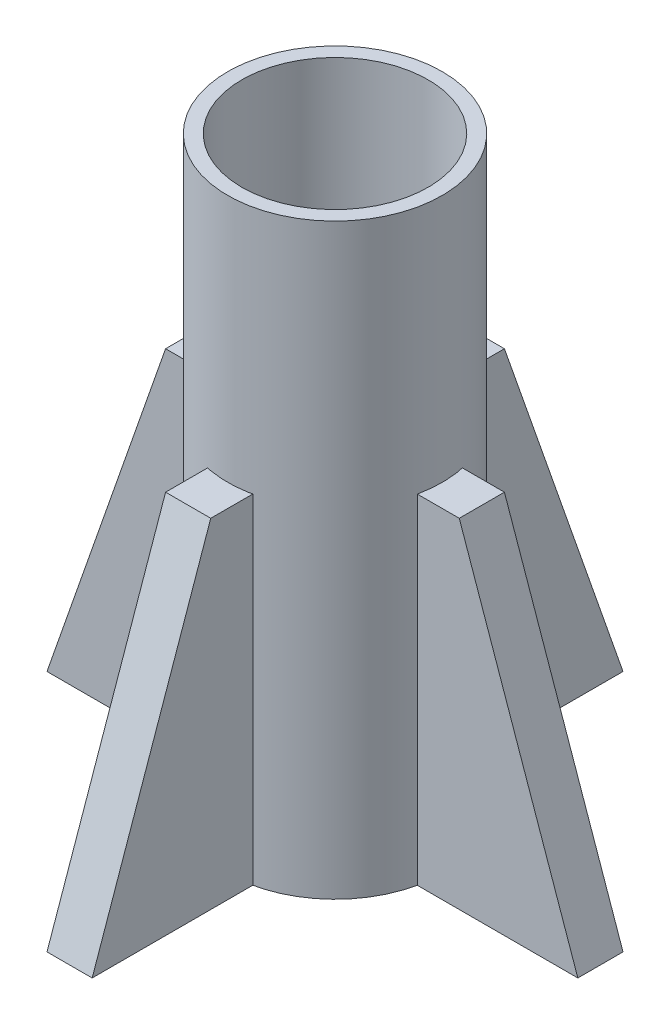
ISO-10303-21;
HEADER;
FILE_DESCRIPTION(('STEP AP214'),'2;1');
FILE_NAME('part.step','',(''),(''),'','','');
FILE_SCHEMA(('AUTOMOTIVE_DESIGN { 1 0 10303 214 1 1 1 1 }'));
ENDSEC;
DATA;
#1=APPLICATION_CONTEXT('core data for automotive mechanical design processes');
#2=APPLICATION_PROTOCOL_DEFINITION('international standard','automotive_design',2000,#1);
#3=PRODUCT_CONTEXT('',#1,'mechanical');
#4=PRODUCT('Part','Part','',(#3));
#5=PRODUCT_RELATED_PRODUCT_CATEGORY('part','',(#4));
#6=PRODUCT_DEFINITION_FORMATION('','',#4);
#7=PRODUCT_DEFINITION_CONTEXT('part definition',#1,'design');
#8=PRODUCT_DEFINITION('design','',#6,#7);
#9=PRODUCT_DEFINITION_SHAPE('','',#8);
#10=(LENGTH_UNIT() NAMED_UNIT(*) SI_UNIT(.MILLI.,.METRE.));
#11=(NAMED_UNIT(*) PLANE_ANGLE_UNIT() SI_UNIT($,.RADIAN.));
#12=(NAMED_UNIT(*) SI_UNIT($,.STERADIAN.) SOLID_ANGLE_UNIT());
#13=UNCERTAINTY_MEASURE_WITH_UNIT(LENGTH_MEASURE(1.E-05),#10,'distance_accuracy_value','');
#14=(GEOMETRIC_REPRESENTATION_CONTEXT(3) GLOBAL_UNCERTAINTY_ASSIGNED_CONTEXT((#13)) GLOBAL_UNIT_ASSIGNED_CONTEXT((#10,
#11,#12)) REPRESENTATION_CONTEXT('',''));
#15=CARTESIAN_POINT('',(0.,0.,0.));
#16=DIRECTION('',(0.,0.,1.));
#17=DIRECTION('',(1.,0.,0.));
#18=AXIS2_PLACEMENT_3D('',#15,#16,#17);
#19=CARTESIAN_POINT('',(8.5,30.,-2.));
#20=DIRECTION('',(0.,1.,0.));
#21=DIRECTION('',(0.,0.,1.));
#22=AXIS2_PLACEMENT_3D('',#19,#20,#21);
#23=PLANE('',#22);
#24=DIRECTION('',(0.,0.,1.));
#25=VECTOR('',#24,1.);
#26=CARTESIAN_POINT('',(8.5,30.,-2.));
#27=LINE('',#26,#25);
#28=CARTESIAN_POINT('',(8.5,30.,-2.));
#29=VERTEX_POINT('',#28);
#30=CARTESIAN_POINT('',(8.5,30.,2.));
#31=VERTEX_POINT('',#30);
#32=EDGE_CURVE('E51',#29,#31,#27,.T.);
#33=ORIENTED_EDGE('',*,*,#32,.T.);
#34=DIRECTION('',(-1.,0.,0.));
#35=VECTOR('',#34,1.);
#36=CARTESIAN_POINT('',(8.5,30.,2.));
#37=LINE('',#36,#35);
#38=CARTESIAN_POINT('',(13.,30.,2.));
#39=VERTEX_POINT('',#38);
#40=EDGE_CURVE('E88',#39,#31,#37,.T.);
#41=ORIENTED_EDGE('',*,*,#40,.F.);
#42=DIRECTION('',(0.,0.,1.));
#43=VECTOR('',#42,1.);
#44=CARTESIAN_POINT('',(13.,30.,-2.));
#45=LINE('',#44,#43);
#46=CARTESIAN_POINT('',(13.,30.,-2.));
#47=VERTEX_POINT('',#46);
#48=EDGE_CURVE('E12',#47,#39,#45,.T.);
#49=ORIENTED_EDGE('',*,*,#48,.F.);
#50=DIRECTION('',(-1.,0.,0.));
#51=VECTOR('',#50,1.);
#52=CARTESIAN_POINT('',(8.5,30.,-2.));
#53=LINE('',#52,#51);
#54=EDGE_CURVE('E89',#47,#29,#53,.T.);
#55=ORIENTED_EDGE('',*,*,#54,.T.);
#56=EDGE_LOOP('',(#33,#41,#49,#55));
#57=FACE_BOUND('',#56,.T.);
#58=ADVANCED_FACE('F48',(#57),#23,.T.);
#59=CARTESIAN_POINT('',(13.,30.,-2.));
#60=DIRECTION('',(0.943858356366017,0.330350424728106,0.));
#61=DIRECTION('',(-0.330350424728106,0.943858356366017,0.));
#62=AXIS2_PLACEMENT_3D('',#59,#60,#61);
#63=PLANE('',#62);
#64=ORIENTED_EDGE('',*,*,#48,.T.);
#65=DIRECTION('',(-0.330350424728106,0.943858356366017,0.));
#66=VECTOR('',#65,1.);
#67=CARTESIAN_POINT('',(13.,30.,2.));
#68=LINE('',#67,#66);
#69=CARTESIAN_POINT('',(23.5,0.,2.));
#70=VERTEX_POINT('',#69);
#71=EDGE_CURVE('E105',#70,#39,#68,.T.);
#72=ORIENTED_EDGE('',*,*,#71,.F.);
#73=DIRECTION('',(0.,0.,1.));
#74=VECTOR('',#73,1.);
#75=CARTESIAN_POINT('',(23.5,0.,-2.));
#76=LINE('',#75,#74);
#77=CARTESIAN_POINT('',(23.5,0.,-2.));
#78=VERTEX_POINT('',#77);
#79=EDGE_CURVE('E56',#78,#70,#76,.T.);
#80=ORIENTED_EDGE('',*,*,#79,.F.);
#81=DIRECTION('',(-0.330350424728106,0.943858356366017,0.));
#82=VECTOR('',#81,1.);
#83=CARTESIAN_POINT('',(13.,30.,-2.));
#84=LINE('',#83,#82);
#85=EDGE_CURVE('E94',#78,#47,#84,.T.);
#86=ORIENTED_EDGE('',*,*,#85,.T.);
#87=EDGE_LOOP('',(#64,#72,#80,#86));
#88=FACE_BOUND('',#87,.T.);
#89=ADVANCED_FACE('F120',(#88),#63,.T.);
#90=CARTESIAN_POINT('',(23.5,0.,-2.));
#91=DIRECTION('',(0.,-1.,0.));
#92=DIRECTION('',(0.,0.,-1.));
#93=AXIS2_PLACEMENT_3D('',#90,#91,#92);
#94=PLANE('',#93);
#95=ORIENTED_EDGE('',*,*,#79,.T.);
#96=DIRECTION('',(1.,0.,0.));
#97=VECTOR('',#96,1.);
#98=CARTESIAN_POINT('',(23.5,0.,2.));
#99=LINE('',#98,#97);
#100=CARTESIAN_POINT('',(8.5,0.,2.));
#101=VERTEX_POINT('',#100);
#102=EDGE_CURVE('E101',#101,#70,#99,.T.);
#103=ORIENTED_EDGE('',*,*,#102,.F.);
#104=DIRECTION('',(0.,0.,1.));
#105=VECTOR('',#104,1.);
#106=CARTESIAN_POINT('',(8.5,0.,-2.));
#107=LINE('',#106,#105);
#108=CARTESIAN_POINT('',(8.5,0.,-2.));
#109=VERTEX_POINT('',#108);
#110=EDGE_CURVE('E93',#109,#101,#107,.T.);
#111=ORIENTED_EDGE('',*,*,#110,.F.);
#112=DIRECTION('',(1.,0.,0.));
#113=VECTOR('',#112,1.);
#114=CARTESIAN_POINT('',(23.5,0.,-2.));
#115=LINE('',#114,#113);
#116=EDGE_CURVE('E113',#109,#78,#115,.T.);
#117=ORIENTED_EDGE('',*,*,#116,.T.);
#118=EDGE_LOOP('',(#95,#103,#111,#117));
#119=FACE_BOUND('',#118,.T.);
#120=ADVANCED_FACE('F117',(#119),#94,.T.);
#121=CARTESIAN_POINT('',(8.5,0.,-2.));
#122=DIRECTION('',(-1.,0.,0.));
#123=DIRECTION('',(0.,-1.,0.));
#124=AXIS2_PLACEMENT_3D('',#121,#122,#123);
#125=PLANE('',#124);
#126=ORIENTED_EDGE('',*,*,#110,.T.);
#127=DIRECTION('',(0.,-1.,0.));
#128=VECTOR('',#127,1.);
#129=CARTESIAN_POINT('',(8.5,0.,2.));
#130=LINE('',#129,#128);
#131=EDGE_CURVE('E96',#31,#101,#130,.T.);
#132=ORIENTED_EDGE('',*,*,#131,.F.);
#133=ORIENTED_EDGE('',*,*,#32,.F.);
#134=DIRECTION('',(0.,-1.,0.));
#135=VECTOR('',#134,1.);
#136=CARTESIAN_POINT('',(8.5,0.,-2.));
#137=LINE('',#136,#135);
#138=EDGE_CURVE('E111',#29,#109,#137,.T.);
#139=ORIENTED_EDGE('',*,*,#138,.T.);
#140=EDGE_LOOP('',(#126,#132,#133,#139));
#141=FACE_BOUND('',#140,.T.);
#142=ADVANCED_FACE('F97',(#141),#125,.T.);
#143=CARTESIAN_POINT('',(0.,0.,-2.));
#144=DIRECTION('',(0.,0.,1.));
#145=DIRECTION('',(1.,0.,0.));
#146=AXIS2_PLACEMENT_3D('',#143,#144,#145);
#147=PLANE('',#146);
#148=ORIENTED_EDGE('',*,*,#54,.F.);
#149=ORIENTED_EDGE('',*,*,#85,.F.);
#150=ORIENTED_EDGE('',*,*,#116,.F.);
#151=ORIENTED_EDGE('',*,*,#138,.F.);
#152=EDGE_LOOP('',(#148,#149,#150,#151));
#153=FACE_BOUND('',#152,.T.);
#154=ADVANCED_FACE('F122',(#153),#147,.F.);
#155=CARTESIAN_POINT('',(0.,0.,2.));
#156=DIRECTION('',(0.,0.,1.));
#157=DIRECTION('',(1.,0.,0.));
#158=AXIS2_PLACEMENT_3D('',#155,#156,#157);
#159=PLANE('',#158);
#160=ORIENTED_EDGE('',*,*,#40,.T.);
#161=ORIENTED_EDGE('',*,*,#131,.T.);
#162=ORIENTED_EDGE('',*,*,#102,.T.);
#163=ORIENTED_EDGE('',*,*,#71,.T.);
#164=EDGE_LOOP('',(#160,#161,#162,#163));
#165=FACE_BOUND('',#164,.T.);
#166=ADVANCED_FACE('F104',(#165),#159,.T.);
#167=CLOSED_SHELL('',(#58,#89,#120,#142,#154,#166));
#168=MANIFOLD_SOLID_BREP('B2',#167);
#169=CARTESIAN_POINT('',(-8.5,0.,-2.));
#170=DIRECTION('',(0.,-1.,0.));
#171=DIRECTION('',(1.,0.,0.));
#172=AXIS2_PLACEMENT_3D('',#169,#170,#171);
#173=PLANE('',#172);
#174=DIRECTION('',(0.,0.,1.));
#175=VECTOR('',#174,1.);
#176=CARTESIAN_POINT('',(-8.5,0.,-2.));
#177=LINE('',#176,#175);
#178=CARTESIAN_POINT('',(-8.5,0.,-2.));
#179=VERTEX_POINT('',#178);
#180=CARTESIAN_POINT('',(-8.5,0.,2.));
#181=VERTEX_POINT('',#180);
#182=EDGE_CURVE('E185',#179,#181,#177,.T.);
#183=ORIENTED_EDGE('',*,*,#182,.T.);
#184=DIRECTION('',(1.,0.,0.));
#185=VECTOR('',#184,1.);
#186=CARTESIAN_POINT('',(-8.5,0.,2.));
#187=LINE('',#186,#185);
#188=CARTESIAN_POINT('',(-23.5,0.,2.));
#189=VERTEX_POINT('',#188);
#190=EDGE_CURVE('E222',#189,#181,#187,.T.);
#191=ORIENTED_EDGE('',*,*,#190,.F.);
#192=DIRECTION('',(0.,0.,1.));
#193=VECTOR('',#192,1.);
#194=CARTESIAN_POINT('',(-23.5,0.,-2.));
#195=LINE('',#194,#193);
#196=CARTESIAN_POINT('',(-23.5,0.,-2.));
#197=VERTEX_POINT('',#196);
#198=EDGE_CURVE('E46',#197,#189,#195,.T.);
#199=ORIENTED_EDGE('',*,*,#198,.F.);
#200=DIRECTION('',(1.,0.,0.));
#201=VECTOR('',#200,1.);
#202=CARTESIAN_POINT('',(-8.5,0.,-2.));
#203=LINE('',#202,#201);
#204=EDGE_CURVE('E223',#197,#179,#203,.T.);
#205=ORIENTED_EDGE('',*,*,#204,.T.);
#206=EDGE_LOOP('',(#183,#191,#199,#205));
#207=FACE_BOUND('',#206,.T.);
#208=ADVANCED_FACE('F182',(#207),#173,.T.);
#209=CARTESIAN_POINT('',(-23.5,0.,-2.));
#210=DIRECTION('',(-0.943858356366017,0.330350424728106,0.));
#211=DIRECTION('',(-0.330350424728106,-0.943858356366018,0.));
#212=AXIS2_PLACEMENT_3D('',#209,#210,#211);
#213=PLANE('',#212);
#214=ORIENTED_EDGE('',*,*,#198,.T.);
#215=DIRECTION('',(-0.330350424728106,-0.943858356366017,0.));
#216=VECTOR('',#215,1.);
#217=CARTESIAN_POINT('',(-23.5,0.,2.));
#218=LINE('',#217,#216);
#219=CARTESIAN_POINT('',(-13.,30.,2.));
#220=VERTEX_POINT('',#219);
#221=EDGE_CURVE('E239',#220,#189,#218,.T.);
#222=ORIENTED_EDGE('',*,*,#221,.F.);
#223=DIRECTION('',(0.,0.,1.));
#224=VECTOR('',#223,1.);
#225=CARTESIAN_POINT('',(-13.,30.,-2.));
#226=LINE('',#225,#224);
#227=CARTESIAN_POINT('',(-13.,30.,-2.));
#228=VERTEX_POINT('',#227);
#229=EDGE_CURVE('E190',#228,#220,#226,.T.);
#230=ORIENTED_EDGE('',*,*,#229,.F.);
#231=DIRECTION('',(-0.330350424728106,-0.943858356366017,0.));
#232=VECTOR('',#231,1.);
#233=CARTESIAN_POINT('',(-23.5,0.,-2.));
#234=LINE('',#233,#232);
#235=EDGE_CURVE('E228',#228,#197,#234,.T.);
#236=ORIENTED_EDGE('',*,*,#235,.T.);
#237=EDGE_LOOP('',(#214,#222,#230,#236));
#238=FACE_BOUND('',#237,.T.);
#239=ADVANCED_FACE('F254',(#238),#213,.T.);
#240=CARTESIAN_POINT('',(-13.,30.,-2.));
#241=DIRECTION('',(0.,1.,0.));
#242=DIRECTION('',(0.,0.,1.));
#243=AXIS2_PLACEMENT_3D('',#240,#241,#242);
#244=PLANE('',#243);
#245=ORIENTED_EDGE('',*,*,#229,.T.);
#246=DIRECTION('',(-1.,0.,0.));
#247=VECTOR('',#246,1.);
#248=CARTESIAN_POINT('',(-13.,30.,2.));
#249=LINE('',#248,#247);
#250=CARTESIAN_POINT('',(-8.5,30.,2.));
#251=VERTEX_POINT('',#250);
#252=EDGE_CURVE('E235',#251,#220,#249,.T.);
#253=ORIENTED_EDGE('',*,*,#252,.F.);
#254=DIRECTION('',(0.,0.,1.));
#255=VECTOR('',#254,1.);
#256=CARTESIAN_POINT('',(-8.5,30.,-2.));
#257=LINE('',#256,#255);
#258=CARTESIAN_POINT('',(-8.5,30.,-2.));
#259=VERTEX_POINT('',#258);
#260=EDGE_CURVE('E227',#259,#251,#257,.T.);
#261=ORIENTED_EDGE('',*,*,#260,.F.);
#262=DIRECTION('',(-1.,0.,0.));
#263=VECTOR('',#262,1.);
#264=CARTESIAN_POINT('',(-13.,30.,-2.));
#265=LINE('',#264,#263);
#266=EDGE_CURVE('E247',#259,#228,#265,.T.);
#267=ORIENTED_EDGE('',*,*,#266,.T.);
#268=EDGE_LOOP('',(#245,#253,#261,#267));
#269=FACE_BOUND('',#268,.T.);
#270=ADVANCED_FACE('F251',(#269),#244,.T.);
#271=CARTESIAN_POINT('',(-8.5,30.,-2.));
#272=DIRECTION('',(1.,0.,0.));
#273=DIRECTION('',(0.,1.,0.));
#274=AXIS2_PLACEMENT_3D('',#271,#272,#273);
#275=PLANE('',#274);
#276=ORIENTED_EDGE('',*,*,#260,.T.);
#277=DIRECTION('',(0.,1.,0.));
#278=VECTOR('',#277,1.);
#279=CARTESIAN_POINT('',(-8.5,30.,2.));
#280=LINE('',#279,#278);
#281=EDGE_CURVE('E230',#181,#251,#280,.T.);
#282=ORIENTED_EDGE('',*,*,#281,.F.);
#283=ORIENTED_EDGE('',*,*,#182,.F.);
#284=DIRECTION('',(0.,1.,0.));
#285=VECTOR('',#284,1.);
#286=CARTESIAN_POINT('',(-8.5,30.,-2.));
#287=LINE('',#286,#285);
#288=EDGE_CURVE('E245',#179,#259,#287,.T.);
#289=ORIENTED_EDGE('',*,*,#288,.T.);
#290=EDGE_LOOP('',(#276,#282,#283,#289));
#291=FACE_BOUND('',#290,.T.);
#292=ADVANCED_FACE('F231',(#291),#275,.T.);
#293=CARTESIAN_POINT('',(0.,0.,-2.));
#294=DIRECTION('',(0.,0.,1.));
#295=DIRECTION('',(1.,0.,0.));
#296=AXIS2_PLACEMENT_3D('',#293,#294,#295);
#297=PLANE('',#296);
#298=ORIENTED_EDGE('',*,*,#204,.F.);
#299=ORIENTED_EDGE('',*,*,#235,.F.);
#300=ORIENTED_EDGE('',*,*,#266,.F.);
#301=ORIENTED_EDGE('',*,*,#288,.F.);
#302=EDGE_LOOP('',(#298,#299,#300,#301));
#303=FACE_BOUND('',#302,.T.);
#304=ADVANCED_FACE('F256',(#303),#297,.F.);
#305=CARTESIAN_POINT('',(0.,0.,2.));
#306=DIRECTION('',(0.,0.,1.));
#307=DIRECTION('',(1.,0.,0.));
#308=AXIS2_PLACEMENT_3D('',#305,#306,#307);
#309=PLANE('',#308);
#310=ORIENTED_EDGE('',*,*,#190,.T.);
#311=ORIENTED_EDGE('',*,*,#281,.T.);
#312=ORIENTED_EDGE('',*,*,#252,.T.);
#313=ORIENTED_EDGE('',*,*,#221,.T.);
#314=EDGE_LOOP('',(#310,#311,#312,#313));
#315=FACE_BOUND('',#314,.T.);
#316=ADVANCED_FACE('F238',(#315),#309,.T.);
#317=CLOSED_SHELL('',(#208,#239,#270,#292,#304,#316));
#318=MANIFOLD_SOLID_BREP('B6',#317);
#319=CARTESIAN_POINT('',(-2.,30.,-8.5));
#320=DIRECTION('',(0.,0.,1.));
#321=DIRECTION('',(0.,-1.,0.));
#322=AXIS2_PLACEMENT_3D('',#319,#320,#321);
#323=PLANE('',#322);
#324=DIRECTION('',(1.,0.,0.));
#325=VECTOR('',#324,1.);
#326=CARTESIAN_POINT('',(-2.,0.,-8.50000000000001));
#327=LINE('',#326,#325);
#328=CARTESIAN_POINT('',(-2.,0.,-8.50000000000001));
#329=VERTEX_POINT('',#328);
#330=CARTESIAN_POINT('',(2.,0.,-8.50000000000001));
#331=VERTEX_POINT('',#330);
#332=EDGE_CURVE('E319',#329,#331,#327,.T.);
#333=ORIENTED_EDGE('',*,*,#332,.T.);
#334=DIRECTION('',(0.,-1.,0.));
#335=VECTOR('',#334,1.);
#336=CARTESIAN_POINT('',(2.,30.,-8.5));
#337=LINE('',#336,#335);
#338=CARTESIAN_POINT('',(2.,30.,-8.5));
#339=VERTEX_POINT('',#338);
#340=EDGE_CURVE('E356',#339,#331,#337,.T.);
#341=ORIENTED_EDGE('',*,*,#340,.F.);
#342=DIRECTION('',(1.,0.,0.));
#343=VECTOR('',#342,1.);
#344=CARTESIAN_POINT('',(-2.,30.,-8.5));
#345=LINE('',#344,#343);
#346=CARTESIAN_POINT('',(-2.,30.,-8.5));
#347=VERTEX_POINT('',#346);
#348=EDGE_CURVE('E180',#347,#339,#345,.T.);
#349=ORIENTED_EDGE('',*,*,#348,.F.);
#350=DIRECTION('',(0.,-1.,0.));
#351=VECTOR('',#350,1.);
#352=CARTESIAN_POINT('',(-2.,30.,-8.5));
#353=LINE('',#352,#351);
#354=EDGE_CURVE('E357',#347,#329,#353,.T.);
#355=ORIENTED_EDGE('',*,*,#354,.T.);
#356=EDGE_LOOP('',(#333,#341,#349,#355));
#357=FACE_BOUND('',#356,.T.);
#358=ADVANCED_FACE('F316',(#357),#323,.T.);
#359=CARTESIAN_POINT('',(-2.,30.,-13.));
#360=DIRECTION('',(0.,1.,0.));
#361=DIRECTION('',(0.,0.,1.));
#362=AXIS2_PLACEMENT_3D('',#359,#360,#361);
#363=PLANE('',#362);
#364=ORIENTED_EDGE('',*,*,#348,.T.);
#365=DIRECTION('',(0.,0.,1.));
#366=VECTOR('',#365,1.);
#367=CARTESIAN_POINT('',(2.,30.,-13.));
#368=LINE('',#367,#366);
#369=CARTESIAN_POINT('',(2.,30.,-13.));
#370=VERTEX_POINT('',#369);
#371=EDGE_CURVE('E373',#370,#339,#368,.T.);
#372=ORIENTED_EDGE('',*,*,#371,.F.);
#373=DIRECTION('',(1.,0.,0.));
#374=VECTOR('',#373,1.);
#375=CARTESIAN_POINT('',(-2.,30.,-13.));
#376=LINE('',#375,#374);
#377=CARTESIAN_POINT('',(-2.,30.,-13.));
#378=VERTEX_POINT('',#377);
#379=EDGE_CURVE('E324',#378,#370,#376,.T.);
#380=ORIENTED_EDGE('',*,*,#379,.F.);
#381=DIRECTION('',(0.,0.,1.));
#382=VECTOR('',#381,1.);
#383=CARTESIAN_POINT('',(-2.,30.,-13.));
#384=LINE('',#383,#382);
#385=EDGE_CURVE('E362',#378,#347,#384,.T.);
#386=ORIENTED_EDGE('',*,*,#385,.T.);
#387=EDGE_LOOP('',(#364,#372,#380,#386));
#388=FACE_BOUND('',#387,.T.);
#389=ADVANCED_FACE('F390',(#388),#363,.T.);
#390=CARTESIAN_POINT('',(-2.,0.,-23.5));
#391=DIRECTION('',(0.,0.330350424728106,-0.943858356366017));
#392=DIRECTION('',(0.,0.943858356366018,0.330350424728106));
#393=AXIS2_PLACEMENT_3D('',#390,#391,#392);
#394=PLANE('',#393);
#395=ORIENTED_EDGE('',*,*,#379,.T.);
#396=DIRECTION('',(0.,0.943858356366017,0.330350424728106));
#397=VECTOR('',#396,1.);
#398=CARTESIAN_POINT('',(2.,0.,-23.5));
#399=LINE('',#398,#397);
#400=CARTESIAN_POINT('',(2.,0.,-23.5));
#401=VERTEX_POINT('',#400);
#402=EDGE_CURVE('E369',#401,#370,#399,.T.);
#403=ORIENTED_EDGE('',*,*,#402,.F.);
#404=DIRECTION('',(1.,0.,0.));
#405=VECTOR('',#404,1.);
#406=CARTESIAN_POINT('',(-2.,0.,-23.5));
#407=LINE('',#406,#405);
#408=CARTESIAN_POINT('',(-2.,0.,-23.5));
#409=VERTEX_POINT('',#408);
#410=EDGE_CURVE('E361',#409,#401,#407,.T.);
#411=ORIENTED_EDGE('',*,*,#410,.F.);
#412=DIRECTION('',(0.,0.943858356366017,0.330350424728106));
#413=VECTOR('',#412,1.);
#414=CARTESIAN_POINT('',(-2.,0.,-23.5));
#415=LINE('',#414,#413);
#416=EDGE_CURVE('E383',#409,#378,#415,.T.);
#417=ORIENTED_EDGE('',*,*,#416,.T.);
#418=EDGE_LOOP('',(#395,#403,#411,#417));
#419=FACE_BOUND('',#418,.T.);
#420=ADVANCED_FACE('F387',(#419),#394,.T.);
#421=CARTESIAN_POINT('',(-2.,0.,-8.50000000000001));
#422=DIRECTION('',(0.,-1.,0.));
#423=DIRECTION('',(0.,0.,-1.));
#424=AXIS2_PLACEMENT_3D('',#421,#422,#423);
#425=PLANE('',#424);
#426=ORIENTED_EDGE('',*,*,#410,.T.);
#427=DIRECTION('',(0.,0.,-1.));
#428=VECTOR('',#427,1.);
#429=CARTESIAN_POINT('',(2.,0.,-8.50000000000001));
#430=LINE('',#429,#428);
#431=EDGE_CURVE('E364',#331,#401,#430,.T.);
#432=ORIENTED_EDGE('',*,*,#431,.F.);
#433=ORIENTED_EDGE('',*,*,#332,.F.);
#434=DIRECTION('',(0.,0.,-1.));
#435=VECTOR('',#434,1.);
#436=CARTESIAN_POINT('',(-2.,0.,-8.50000000000001));
#437=LINE('',#436,#435);
#438=EDGE_CURVE('E381',#329,#409,#437,.T.);
#439=ORIENTED_EDGE('',*,*,#438,.T.);
#440=EDGE_LOOP('',(#426,#432,#433,#439));
#441=FACE_BOUND('',#440,.T.);
#442=ADVANCED_FACE('F365',(#441),#425,.T.);
#443=CARTESIAN_POINT('',(-2.,0.,0.));
#444=DIRECTION('',(1.,0.,0.));
#445=DIRECTION('',(0.,0.,-1.));
#446=AXIS2_PLACEMENT_3D('',#443,#444,#445);
#447=PLANE('',#446);
#448=ORIENTED_EDGE('',*,*,#354,.F.);
#449=ORIENTED_EDGE('',*,*,#385,.F.);
#450=ORIENTED_EDGE('',*,*,#416,.F.);
#451=ORIENTED_EDGE('',*,*,#438,.F.);
#452=EDGE_LOOP('',(#448,#449,#450,#451));
#453=FACE_BOUND('',#452,.T.);
#454=ADVANCED_FACE('F392',(#453),#447,.F.);
#455=CARTESIAN_POINT('',(2.,0.,0.));
#456=DIRECTION('',(1.,0.,0.));
#457=DIRECTION('',(0.,0.,-1.));
#458=AXIS2_PLACEMENT_3D('',#455,#456,#457);
#459=PLANE('',#458);
#460=ORIENTED_EDGE('',*,*,#340,.T.);
#461=ORIENTED_EDGE('',*,*,#431,.T.);
#462=ORIENTED_EDGE('',*,*,#402,.T.);
#463=ORIENTED_EDGE('',*,*,#371,.T.);
#464=EDGE_LOOP('',(#460,#461,#462,#463));
#465=FACE_BOUND('',#464,.T.);
#466=ADVANCED_FACE('F372',(#465),#459,.T.);
#467=CLOSED_SHELL('',(#358,#389,#420,#442,#454,#466));
#468=MANIFOLD_SOLID_BREP('B40',#467);
#469=CARTESIAN_POINT('',(-2.,0.,23.5));
#470=DIRECTION('',(0.,-1.,0.));
#471=DIRECTION('',(0.,0.,-1.));
#472=AXIS2_PLACEMENT_3D('',#469,#470,#471);
#473=PLANE('',#472);
#474=DIRECTION('',(1.,0.,0.));
#475=VECTOR('',#474,1.);
#476=CARTESIAN_POINT('',(-2.,0.,8.5));
#477=LINE('',#476,#475);
#478=CARTESIAN_POINT('',(-2.,0.,8.5));
#479=VERTEX_POINT('',#478);
#480=CARTESIAN_POINT('',(2.,0.,8.5));
#481=VERTEX_POINT('',#480);
#482=EDGE_CURVE('E454',#479,#481,#477,.T.);
#483=ORIENTED_EDGE('',*,*,#482,.T.);
#484=DIRECTION('',(0.,0.,-1.));
#485=VECTOR('',#484,1.);
#486=CARTESIAN_POINT('',(2.,0.,23.5));
#487=LINE('',#486,#485);
#488=CARTESIAN_POINT('',(2.,0.,23.5));
#489=VERTEX_POINT('',#488);
#490=EDGE_CURVE('E491',#489,#481,#487,.T.);
#491=ORIENTED_EDGE('',*,*,#490,.F.);
#492=DIRECTION('',(1.,0.,0.));
#493=VECTOR('',#492,1.);
#494=CARTESIAN_POINT('',(-2.,0.,23.5));
#495=LINE('',#494,#493);
#496=CARTESIAN_POINT('',(-2.,0.,23.5));
#497=VERTEX_POINT('',#496);
#498=EDGE_CURVE('E314',#497,#489,#495,.T.);
#499=ORIENTED_EDGE('',*,*,#498,.F.);
#500=DIRECTION('',(0.,0.,-1.));
#501=VECTOR('',#500,1.);
#502=CARTESIAN_POINT('',(-2.,0.,23.5));
#503=LINE('',#502,#501);
#504=EDGE_CURVE('E492',#497,#479,#503,.T.);
#505=ORIENTED_EDGE('',*,*,#504,.T.);
#506=EDGE_LOOP('',(#483,#491,#499,#505));
#507=FACE_BOUND('',#506,.T.);
#508=ADVANCED_FACE('F451',(#507),#473,.T.);
#509=CARTESIAN_POINT('',(-2.,30.,13.));
#510=DIRECTION('',(0.,0.330350424728106,0.943858356366017));
#511=DIRECTION('',(0.,-0.943858356366017,0.330350424728106));
#512=AXIS2_PLACEMENT_3D('',#509,#510,#511);
#513=PLANE('',#512);
#514=ORIENTED_EDGE('',*,*,#498,.T.);
#515=DIRECTION('',(0.,-0.943858356366017,0.330350424728106));
#516=VECTOR('',#515,1.);
#517=CARTESIAN_POINT('',(2.,30.,13.));
#518=LINE('',#517,#516);
#519=CARTESIAN_POINT('',(2.,30.,13.));
#520=VERTEX_POINT('',#519);
#521=EDGE_CURVE('E508',#520,#489,#518,.T.);
#522=ORIENTED_EDGE('',*,*,#521,.F.);
#523=DIRECTION('',(1.,0.,0.));
#524=VECTOR('',#523,1.);
#525=CARTESIAN_POINT('',(-2.,30.,13.));
#526=LINE('',#525,#524);
#527=CARTESIAN_POINT('',(-2.,30.,13.));
#528=VERTEX_POINT('',#527);
#529=EDGE_CURVE('E459',#528,#520,#526,.T.);
#530=ORIENTED_EDGE('',*,*,#529,.F.);
#531=DIRECTION('',(0.,-0.943858356366017,0.330350424728106));
#532=VECTOR('',#531,1.);
#533=CARTESIAN_POINT('',(-2.,30.,13.));
#534=LINE('',#533,#532);
#535=EDGE_CURVE('E497',#528,#497,#534,.T.);
#536=ORIENTED_EDGE('',*,*,#535,.T.);
#537=EDGE_LOOP('',(#514,#522,#530,#536));
#538=FACE_BOUND('',#537,.T.);
#539=ADVANCED_FACE('F523',(#538),#513,.T.);
#540=CARTESIAN_POINT('',(-2.,30.,13.));
#541=DIRECTION('',(0.,1.,0.));
#542=DIRECTION('',(0.,0.,1.));
#543=AXIS2_PLACEMENT_3D('',#540,#541,#542);
#544=PLANE('',#543);
#545=ORIENTED_EDGE('',*,*,#529,.T.);
#546=DIRECTION('',(0.,0.,1.));
#547=VECTOR('',#546,1.);
#548=CARTESIAN_POINT('',(2.,30.,13.));
#549=LINE('',#548,#547);
#550=CARTESIAN_POINT('',(2.,30.,8.5));
#551=VERTEX_POINT('',#550);
#552=EDGE_CURVE('E504',#551,#520,#549,.T.);
#553=ORIENTED_EDGE('',*,*,#552,.F.);
#554=DIRECTION('',(1.,0.,0.));
#555=VECTOR('',#554,1.);
#556=CARTESIAN_POINT('',(-2.,30.,8.5));
#557=LINE('',#556,#555);
#558=CARTESIAN_POINT('',(-2.,30.,8.5));
#559=VERTEX_POINT('',#558);
#560=EDGE_CURVE('E496',#559,#551,#557,.T.);
#561=ORIENTED_EDGE('',*,*,#560,.F.);
#562=DIRECTION('',(0.,0.,1.));
#563=VECTOR('',#562,1.);
#564=CARTESIAN_POINT('',(-2.,30.,13.));
#565=LINE('',#564,#563);
#566=EDGE_CURVE('E516',#559,#528,#565,.T.);
#567=ORIENTED_EDGE('',*,*,#566,.T.);
#568=EDGE_LOOP('',(#545,#553,#561,#567));
#569=FACE_BOUND('',#568,.T.);
#570=ADVANCED_FACE('F520',(#569),#544,.T.);
#571=CARTESIAN_POINT('',(-2.,0.,8.5));
#572=DIRECTION('',(0.,0.,-1.));
#573=DIRECTION('',(-1.,0.,0.));
#574=AXIS2_PLACEMENT_3D('',#571,#572,#573);
#575=PLANE('',#574);
#576=ORIENTED_EDGE('',*,*,#560,.T.);
#577=DIRECTION('',(0.,1.,0.));
#578=VECTOR('',#577,1.);
#579=CARTESIAN_POINT('',(2.,0.,8.5));
#580=LINE('',#579,#578);
#581=EDGE_CURVE('E499',#481,#551,#580,.T.);
#582=ORIENTED_EDGE('',*,*,#581,.F.);
#583=ORIENTED_EDGE('',*,*,#482,.F.);
#584=DIRECTION('',(0.,1.,0.));
#585=VECTOR('',#584,1.);
#586=CARTESIAN_POINT('',(-2.,0.,8.5));
#587=LINE('',#586,#585);
#588=EDGE_CURVE('E514',#479,#559,#587,.T.);
#589=ORIENTED_EDGE('',*,*,#588,.T.);
#590=EDGE_LOOP('',(#576,#582,#583,#589));
#591=FACE_BOUND('',#590,.T.);
#592=ADVANCED_FACE('F500',(#591),#575,.T.);
#593=CARTESIAN_POINT('',(-2.,0.,0.));
#594=DIRECTION('',(1.,0.,0.));
#595=DIRECTION('',(0.,0.,-1.));
#596=AXIS2_PLACEMENT_3D('',#593,#594,#595);
#597=PLANE('',#596);
#598=ORIENTED_EDGE('',*,*,#504,.F.);
#599=ORIENTED_EDGE('',*,*,#535,.F.);
#600=ORIENTED_EDGE('',*,*,#566,.F.);
#601=ORIENTED_EDGE('',*,*,#588,.F.);
#602=EDGE_LOOP('',(#598,#599,#600,#601));
#603=FACE_BOUND('',#602,.T.);
#604=ADVANCED_FACE('F525',(#603),#597,.F.);
#605=CARTESIAN_POINT('',(2.,0.,0.));
#606=DIRECTION('',(1.,0.,0.));
#607=DIRECTION('',(0.,0.,-1.));
#608=AXIS2_PLACEMENT_3D('',#605,#606,#607);
#609=PLANE('',#608);
#610=ORIENTED_EDGE('',*,*,#490,.T.);
#611=ORIENTED_EDGE('',*,*,#581,.T.);
#612=ORIENTED_EDGE('',*,*,#552,.T.);
#613=ORIENTED_EDGE('',*,*,#521,.T.);
#614=EDGE_LOOP('',(#610,#611,#612,#613));
#615=FACE_BOUND('',#614,.T.);
#616=ADVANCED_FACE('F507',(#615),#609,.T.);
#617=CLOSED_SHELL('',(#508,#539,#570,#592,#604,#616));
#618=MANIFOLD_SOLID_BREP('B174',#617);
#619=CARTESIAN_POINT('',(0.,52.,0.));
#620=DIRECTION('',(0.,-1.,0.));
#621=DIRECTION('',(0.,0.,-1.));
#622=AXIS2_PLACEMENT_3D('',#619,#620,#621);
#623=CYLINDRICAL_SURFACE('',#622,9.5);
#624=CARTESIAN_POINT('',(0.,52.,0.));
#625=DIRECTION('',(0.,1.,0.));
#626=DIRECTION('',(0.,0.,1.));
#627=AXIS2_PLACEMENT_3D('',#624,#625,#626);
#628=CIRCLE('',#627,9.5);
#629=CARTESIAN_POINT('',(0.,52.,-9.5));
#630=VERTEX_POINT('',#629);
#631=EDGE_CURVE('E450',#630,#630,#628,.T.);
#632=CARTESIAN_POINT('',(0.,0.,0.));
#633=DIRECTION('',(0.,1.,0.));
#634=DIRECTION('',(0.,0.,1.));
#635=AXIS2_PLACEMENT_3D('',#632,#633,#634);
#636=CIRCLE('',#635,9.5);
#637=CARTESIAN_POINT('',(0.,0.,-9.5));
#638=VERTEX_POINT('',#637);
#639=EDGE_CURVE('E578',#638,#638,#636,.T.);
#640=CARTESIAN_POINT('',(0.,52.,-9.5));
#641=CARTESIAN_POINT('',(0.,51.4583333333333,-9.5));
#642=CARTESIAN_POINT('',(0.,50.9166666666667,-9.5));
#643=CARTESIAN_POINT('',(0.,49.8333333333333,-9.5));
#644=CARTESIAN_POINT('',(0.,49.2916666666667,-9.5));
#645=CARTESIAN_POINT('',(0.,48.2083333333333,-9.5));
#646=CARTESIAN_POINT('',(0.,47.6666666666667,-9.5));
#647=CARTESIAN_POINT('',(0.,46.5833333333333,-9.5));
#648=CARTESIAN_POINT('',(0.,46.0416666666667,-9.5));
#649=CARTESIAN_POINT('',(0.,44.9583333333333,-9.5));
#650=CARTESIAN_POINT('',(0.,44.4166666666667,-9.5));
#651=CARTESIAN_POINT('',(0.,43.3333333333333,-9.5));
#652=CARTESIAN_POINT('',(0.,42.7916666666667,-9.5));
#653=CARTESIAN_POINT('',(0.,41.7083333333333,-9.5));
#654=CARTESIAN_POINT('',(0.,41.1666666666667,-9.5));
#655=CARTESIAN_POINT('',(0.,40.0833333333333,-9.5));
#656=CARTESIAN_POINT('',(0.,39.5416666666667,-9.5));
#657=CARTESIAN_POINT('',(0.,38.4583333333333,-9.5));
#658=CARTESIAN_POINT('',(0.,37.9166666666667,-9.5));
#659=CARTESIAN_POINT('',(0.,36.8333333333333,-9.5));
#660=CARTESIAN_POINT('',(0.,36.2916666666667,-9.5));
#661=CARTESIAN_POINT('',(0.,35.2083333333333,-9.5));
#662=CARTESIAN_POINT('',(0.,34.6666666666667,-9.5));
#663=CARTESIAN_POINT('',(0.,33.5833333333333,-9.5));
#664=CARTESIAN_POINT('',(0.,33.0416666666667,-9.5));
#665=CARTESIAN_POINT('',(0.,31.9583333333333,-9.5));
#666=CARTESIAN_POINT('',(0.,31.4166666666667,-9.5));
#667=CARTESIAN_POINT('',(0.,30.3333333333333,-9.5));
#668=CARTESIAN_POINT('',(0.,29.7916666666667,-9.5));
#669=CARTESIAN_POINT('',(0.,28.7083333333333,-9.5));
#670=CARTESIAN_POINT('',(0.,28.1666666666667,-9.5));
#671=CARTESIAN_POINT('',(0.,27.0833333333333,-9.5));
#672=CARTESIAN_POINT('',(0.,26.5416666666667,-9.5));
#673=CARTESIAN_POINT('',(0.,25.4583333333333,-9.5));
#674=CARTESIAN_POINT('',(0.,24.9166666666667,-9.5));
#675=CARTESIAN_POINT('',(0.,23.8333333333333,-9.5));
#676=CARTESIAN_POINT('',(0.,23.2916666666667,-9.5));
#677=CARTESIAN_POINT('',(0.,22.2083333333333,-9.5));
#678=CARTESIAN_POINT('',(0.,21.6666666666667,-9.5));
#679=CARTESIAN_POINT('',(0.,20.5833333333333,-9.5));
#680=CARTESIAN_POINT('',(0.,20.0416666666667,-9.5));
#681=CARTESIAN_POINT('',(0.,18.9583333333333,-9.5));
#682=CARTESIAN_POINT('',(0.,18.4166666666667,-9.5));
#683=CARTESIAN_POINT('',(0.,17.3333333333333,-9.5));
#684=CARTESIAN_POINT('',(0.,16.7916666666667,-9.5));
#685=CARTESIAN_POINT('',(0.,15.7083333333333,-9.5));
#686=CARTESIAN_POINT('',(0.,15.1666666666667,-9.5));
#687=CARTESIAN_POINT('',(0.,14.0833333333333,-9.5));
#688=CARTESIAN_POINT('',(0.,13.5416666666667,-9.5));
#689=CARTESIAN_POINT('',(0.,12.4583333333333,-9.5));
#690=CARTESIAN_POINT('',(0.,11.9166666666667,-9.5));
#691=CARTESIAN_POINT('',(0.,10.8333333333333,-9.5));
#692=CARTESIAN_POINT('',(0.,10.2916666666667,-9.5));
#693=CARTESIAN_POINT('',(0.,9.20833333333333,-9.5));
#694=CARTESIAN_POINT('',(0.,8.66666666666667,-9.5));
#695=CARTESIAN_POINT('',(0.,7.58333333333333,-9.5));
#696=CARTESIAN_POINT('',(0.,7.04166666666667,-9.5));
#697=CARTESIAN_POINT('',(0.,5.95833333333333,-9.5));
#698=CARTESIAN_POINT('',(0.,5.41666666666667,-9.5));
#699=CARTESIAN_POINT('',(0.,4.33333333333333,-9.5));
#700=CARTESIAN_POINT('',(0.,3.79166666666667,-9.5));
#701=CARTESIAN_POINT('',(0.,2.70833333333334,-9.5));
#702=CARTESIAN_POINT('',(0.,2.16666666666667,-9.5));
#703=CARTESIAN_POINT('',(0.,1.08333333333333,-9.5));
#704=CARTESIAN_POINT('',(0.,0.541666666666667,-9.5));
#705=CARTESIAN_POINT('',(0.,0.,-9.5));
#706=B_SPLINE_CURVE_WITH_KNOTS('',3,(#640,#641,#642,#643,#644,#645,#646,#647,#648,#649,#650,
#651,#652,#653,#654,#655,#656,#657,#658,#659,#660,#661,#662,#663,#664,#665,#666,#667,#668,#669,
#670,#671,#672,#673,#674,#675,#676,#677,#678,#679,#680,#681,#682,#683,#684,#685,#686,#687,#688,
#689,#690,#691,#692,#693,#694,#695,#696,#697,#698,#699,#700,#701,#702,#703,#704,#705),
.UNSPECIFIED.,.F.,.F.,(4,2,2,2,2,2,2,2,2,2,2,2,2,2,2,2,2,2,2,2,2,2,2,2,2,2,2,2,2,2,2,2,4),(0.,
1.625,3.25,4.875,6.50000000000001,8.125,9.75,11.375,13.,14.625,16.25,17.875,19.5,21.125,22.75,
24.375,26.,27.625,29.25,30.875,32.5,34.125,35.75,37.375,39.,40.625,42.25,43.875,45.5,47.125,
48.75,50.375,52.),.UNSPECIFIED.);
#707=EDGE_CURVE('BSEAM575',#630,#638,#706,.T.);
#708=ORIENTED_EDGE('',*,*,#631,.F.);
#709=ORIENTED_EDGE('',*,*,#639,.T.);
#710=ORIENTED_EDGE('',*,*,#707,.T.);
#711=ORIENTED_EDGE('',*,*,#707,.F.);
#712=EDGE_LOOP('',(#708,#710,#709,#711));
#713=FACE_BOUND('',#712,.T.);
#714=ADVANCED_FACE('F575',(#713),#623,.T.);
#715=CARTESIAN_POINT('',(0.,52.,0.));
#716=DIRECTION('',(0.,1.,0.));
#717=DIRECTION('',(0.,0.,1.));
#718=AXIS2_PLACEMENT_3D('',#715,#716,#717);
#719=PLANE('',#718);
#720=CARTESIAN_POINT('',(0.,52.,0.));
#721=DIRECTION('',(0.,1.,0.));
#722=DIRECTION('',(0.,0.,1.));
#723=AXIS2_PLACEMENT_3D('',#720,#721,#722);
#724=CIRCLE('',#723,8.25);
#725=CARTESIAN_POINT('',(0.,52.,8.25));
#726=VERTEX_POINT('',#725);
#727=EDGE_CURVE('E587',#726,#726,#724,.T.);
#728=ORIENTED_EDGE('',*,*,#727,.F.);
#729=EDGE_LOOP('',(#728));
#730=FACE_BOUND('',#729,.T.);
#731=ORIENTED_EDGE('',*,*,#631,.T.);
#732=EDGE_LOOP('',(#731));
#733=FACE_BOUND('',#732,.T.);
#734=ADVANCED_FACE('F602',(#730,#733),#719,.T.);
#735=CARTESIAN_POINT('',(0.,0.,0.));
#736=DIRECTION('',(0.,1.,0.));
#737=DIRECTION('',(0.,0.,1.));
#738=AXIS2_PLACEMENT_3D('',#735,#736,#737);
#739=PLANE('',#738);
#740=ORIENTED_EDGE('',*,*,#639,.F.);
#741=EDGE_LOOP('',(#740));
#742=FACE_BOUND('',#741,.T.);
#743=ADVANCED_FACE('F598',(#742),#739,.F.);
#744=CARTESIAN_POINT('',(0.,1.99999999999999,0.));
#745=DIRECTION('',(0.,1.,0.));
#746=DIRECTION('',(0.,0.,1.));
#747=AXIS2_PLACEMENT_3D('',#744,#745,#746);
#748=CYLINDRICAL_SURFACE('',#747,8.25);
#749=CARTESIAN_POINT('',(0.,1.99999999999999,0.));
#750=DIRECTION('',(0.,1.,0.));
#751=DIRECTION('',(0.,0.,1.));
#752=AXIS2_PLACEMENT_3D('',#749,#750,#751);
#753=CIRCLE('',#752,8.25);
#754=CARTESIAN_POINT('',(0.,1.99999999999999,8.25));
#755=VERTEX_POINT('',#754);
#756=EDGE_CURVE('E585',#755,#755,#753,.T.);
#757=ORIENTED_EDGE('',*,*,#756,.F.);
#758=EDGE_LOOP('',(#757));
#759=FACE_BOUND('',#758,.T.);
#760=ORIENTED_EDGE('',*,*,#727,.T.);
#761=EDGE_LOOP('',(#760));
#762=FACE_BOUND('',#761,.T.);
#763=ADVANCED_FACE('F595',(#759,#762),#748,.F.);
#764=CARTESIAN_POINT('',(0.,1.99999999999999,0.));
#765=DIRECTION('',(0.,1.,0.));
#766=DIRECTION('',(0.,0.,1.));
#767=AXIS2_PLACEMENT_3D('',#764,#765,#766);
#768=PLANE('',#767);
#769=ORIENTED_EDGE('',*,*,#756,.T.);
#770=EDGE_LOOP('',(#769));
#771=FACE_BOUND('',#770,.T.);
#772=ADVANCED_FACE('F593',(#771),#768,.T.);
#773=CLOSED_SHELL('',(#714,#734,#743,#763,#772));
#774=MANIFOLD_SOLID_BREP('B308',#773);
#775=ADVANCED_BREP_SHAPE_REPRESENTATION('',(#18,#168,#318,#468,#618,#774),#14);
#776=SHAPE_DEFINITION_REPRESENTATION(#9,#775);
ENDSEC;
END-ISO-10303-21;
